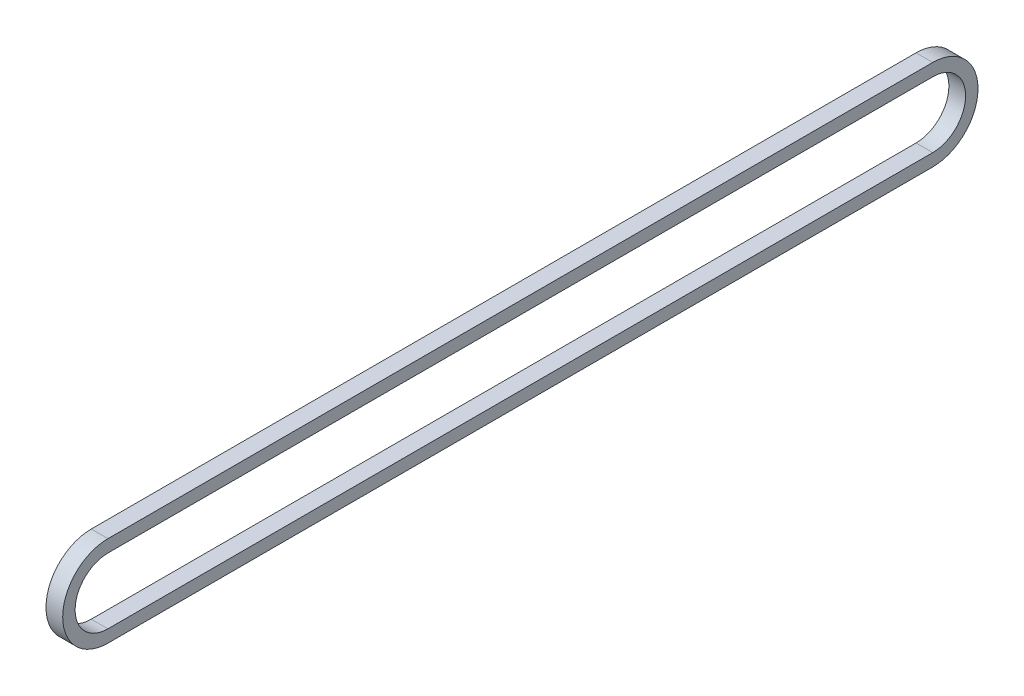
ISO-10303-21;
HEADER;
FILE_DESCRIPTION(('STEP AP214'),'2;1');
FILE_NAME('part.step','',(''),(''),'','','');
FILE_SCHEMA(('AUTOMOTIVE_DESIGN { 1 0 10303 214 1 1 1 1 }'));
ENDSEC;
DATA;
#1=APPLICATION_CONTEXT('core data for automotive mechanical design processes');
#2=APPLICATION_PROTOCOL_DEFINITION('international standard','automotive_design',2000,#1);
#3=PRODUCT_CONTEXT('',#1,'mechanical');
#4=PRODUCT('Part','Part','',(#3));
#5=PRODUCT_RELATED_PRODUCT_CATEGORY('part','',(#4));
#6=PRODUCT_DEFINITION_FORMATION('','',#4);
#7=PRODUCT_DEFINITION_CONTEXT('part definition',#1,'design');
#8=PRODUCT_DEFINITION('design','',#6,#7);
#9=PRODUCT_DEFINITION_SHAPE('','',#8);
#10=(LENGTH_UNIT() NAMED_UNIT(*) SI_UNIT(.MILLI.,.METRE.));
#11=(NAMED_UNIT(*) PLANE_ANGLE_UNIT() SI_UNIT($,.RADIAN.));
#12=(NAMED_UNIT(*) SI_UNIT($,.STERADIAN.) SOLID_ANGLE_UNIT());
#13=UNCERTAINTY_MEASURE_WITH_UNIT(LENGTH_MEASURE(1.E-05),#10,'distance_accuracy_value','');
#14=(GEOMETRIC_REPRESENTATION_CONTEXT(3) GLOBAL_UNCERTAINTY_ASSIGNED_CONTEXT((#13)) GLOBAL_UNIT_ASSIGNED_CONTEXT((#10,
#11,#12)) REPRESENTATION_CONTEXT('',''));
#15=CARTESIAN_POINT('',(0.,0.,0.));
#16=DIRECTION('',(0.,0.,1.));
#17=DIRECTION('',(1.,0.,0.));
#18=AXIS2_PLACEMENT_3D('',#15,#16,#17);
#19=CARTESIAN_POINT('',(3.8862,0.,0.));
#20=DIRECTION('',(1.,0.,0.));
#21=DIRECTION('',(0.,0.,-1.));
#22=AXIS2_PLACEMENT_3D('',#19,#20,#21);
#23=PLANE('',#22);
#24=CARTESIAN_POINT('',(3.8862,0.,0.));
#25=DIRECTION('',(1.,0.,0.));
#26=DIRECTION('',(0.,0.,-1.));
#27=AXIS2_PLACEMENT_3D('',#24,#25,#26);
#28=CIRCLE('',#27,21.082);
#29=CARTESIAN_POINT('',(3.8862,21.082,0.));
#30=VERTEX_POINT('',#29);
#31=CARTESIAN_POINT('',(3.8862,-21.082,0.));
#32=VERTEX_POINT('',#31);
#33=EDGE_CURVE('E165',#30,#32,#28,.T.);
#34=ORIENTED_EDGE('',*,*,#33,.T.);
#35=DIRECTION('',(0.,0.,-1.));
#36=VECTOR('',#35,1.);
#37=CARTESIAN_POINT('',(3.8862,-21.082,0.));
#38=LINE('',#37,#36);
#39=CARTESIAN_POINT('',(3.8862,-21.082,-384.172599954));
#40=VERTEX_POINT('',#39);
#41=EDGE_CURVE('E168',#32,#40,#38,.T.);
#42=ORIENTED_EDGE('',*,*,#41,.T.);
#43=CARTESIAN_POINT('',(3.8862,0.,-384.172599954));
#44=DIRECTION('',(1.,0.,0.));
#45=DIRECTION('',(0.,0.,-1.));
#46=AXIS2_PLACEMENT_3D('',#43,#44,#45);
#47=CIRCLE('',#46,21.082);
#48=CARTESIAN_POINT('',(3.8862,21.082,-384.172599954));
#49=VERTEX_POINT('',#48);
#50=EDGE_CURVE('E171',#40,#49,#47,.T.);
#51=ORIENTED_EDGE('',*,*,#50,.T.);
#52=DIRECTION('',(0.,0.,-1.));
#53=VECTOR('',#52,1.);
#54=CARTESIAN_POINT('',(3.8862,21.082,0.));
#55=LINE('',#54,#53);
#56=EDGE_CURVE('E173',#30,#49,#55,.T.);
#57=ORIENTED_EDGE('',*,*,#56,.F.);
#58=EDGE_LOOP('',(#34,#42,#51,#57));
#59=FACE_BOUND('',#58,.T.);
#60=DIRECTION('',(0.,0.,-1.));
#61=VECTOR('',#60,1.);
#62=CARTESIAN_POINT('',(3.8862,-15.2908,0.));
#63=LINE('',#62,#61);
#64=CARTESIAN_POINT('',(3.8862,-15.2908,0.));
#65=VERTEX_POINT('',#64);
#66=CARTESIAN_POINT('',(3.8862,-15.2908,-384.172599954));
#67=VERTEX_POINT('',#66);
#68=EDGE_CURVE('E138',#65,#67,#63,.T.);
#69=ORIENTED_EDGE('',*,*,#68,.F.);
#70=CARTESIAN_POINT('',(3.8862,0.,0.));
#71=DIRECTION('',(1.,0.,0.));
#72=DIRECTION('',(0.,0.,-1.));
#73=AXIS2_PLACEMENT_3D('',#70,#71,#72);
#74=CIRCLE('',#73,15.2908);
#75=CARTESIAN_POINT('',(3.8862,15.2908,0.));
#76=VERTEX_POINT('',#75);
#77=EDGE_CURVE('E130',#76,#65,#74,.T.);
#78=ORIENTED_EDGE('',*,*,#77,.F.);
#79=DIRECTION('',(0.,0.,-1.));
#80=VECTOR('',#79,1.);
#81=CARTESIAN_POINT('',(3.8862,15.2908,0.));
#82=LINE('',#81,#80);
#83=CARTESIAN_POINT('',(3.8862,15.2908,-384.172599954));
#84=VERTEX_POINT('',#83);
#85=EDGE_CURVE('E152',#76,#84,#82,.T.);
#86=ORIENTED_EDGE('',*,*,#85,.T.);
#87=CARTESIAN_POINT('',(3.8862,0.,-384.172599954));
#88=DIRECTION('',(1.,0.,0.));
#89=DIRECTION('',(0.,0.,-1.));
#90=AXIS2_PLACEMENT_3D('',#87,#88,#89);
#91=CIRCLE('',#90,15.2908);
#92=EDGE_CURVE('E150',#67,#84,#91,.T.);
#93=ORIENTED_EDGE('',*,*,#92,.F.);
#94=EDGE_LOOP('',(#69,#78,#86,#93));
#95=FACE_BOUND('',#94,.T.);
#96=ADVANCED_FACE('F65',(#59,#95),#23,.T.);
#97=CARTESIAN_POINT('',(-3.8862,0.,0.));
#98=DIRECTION('',(1.,0.,0.));
#99=DIRECTION('',(0.,0.,-1.));
#100=AXIS2_PLACEMENT_3D('',#97,#98,#99);
#101=PLANE('',#100);
#102=CARTESIAN_POINT('',(-3.8862,0.,0.));
#103=DIRECTION('',(1.,0.,0.));
#104=DIRECTION('',(0.,0.,-1.));
#105=AXIS2_PLACEMENT_3D('',#102,#103,#104);
#106=CIRCLE('',#105,21.082);
#107=CARTESIAN_POINT('',(-3.8862,21.082,0.));
#108=VERTEX_POINT('',#107);
#109=CARTESIAN_POINT('',(-3.8862,-21.082,0.));
#110=VERTEX_POINT('',#109);
#111=EDGE_CURVE('E146',#108,#110,#106,.T.);
#112=ORIENTED_EDGE('',*,*,#111,.F.);
#113=DIRECTION('',(0.,0.,-1.));
#114=VECTOR('',#113,1.);
#115=CARTESIAN_POINT('',(-3.8862,21.082,0.));
#116=LINE('',#115,#114);
#117=CARTESIAN_POINT('',(-3.8862,21.082,-384.172599954));
#118=VERTEX_POINT('',#117);
#119=EDGE_CURVE('E169',#108,#118,#116,.T.);
#120=ORIENTED_EDGE('',*,*,#119,.T.);
#121=CARTESIAN_POINT('',(-3.8862,0.,-384.172599954));
#122=DIRECTION('',(1.,0.,0.));
#123=DIRECTION('',(0.,0.,-1.));
#124=AXIS2_PLACEMENT_3D('',#121,#122,#123);
#125=CIRCLE('',#124,21.082);
#126=CARTESIAN_POINT('',(-3.8862,-21.082,-384.172599954));
#127=VERTEX_POINT('',#126);
#128=EDGE_CURVE('E181',#127,#118,#125,.T.);
#129=ORIENTED_EDGE('',*,*,#128,.F.);
#130=DIRECTION('',(0.,0.,-1.));
#131=VECTOR('',#130,1.);
#132=CARTESIAN_POINT('',(-3.8862,-21.082,0.));
#133=LINE('',#132,#131);
#134=EDGE_CURVE('E179',#110,#127,#133,.T.);
#135=ORIENTED_EDGE('',*,*,#134,.F.);
#136=EDGE_LOOP('',(#112,#120,#129,#135));
#137=FACE_BOUND('',#136,.T.);
#138=CARTESIAN_POINT('',(-3.8862,0.,0.));
#139=DIRECTION('',(1.,0.,0.));
#140=DIRECTION('',(0.,0.,-1.));
#141=AXIS2_PLACEMENT_3D('',#138,#139,#140);
#142=CIRCLE('',#141,15.2908);
#143=CARTESIAN_POINT('',(-3.8862,15.2908,0.));
#144=VERTEX_POINT('',#143);
#145=CARTESIAN_POINT('',(-3.8862,-15.2908,0.));
#146=VERTEX_POINT('',#145);
#147=EDGE_CURVE('E88',#144,#146,#142,.T.);
#148=ORIENTED_EDGE('',*,*,#147,.T.);
#149=DIRECTION('',(0.,0.,-1.));
#150=VECTOR('',#149,1.);
#151=CARTESIAN_POINT('',(-3.8862,-15.2908,0.));
#152=LINE('',#151,#150);
#153=CARTESIAN_POINT('',(-3.8862,-15.2908,-384.172599954));
#154=VERTEX_POINT('',#153);
#155=EDGE_CURVE('E145',#146,#154,#152,.T.);
#156=ORIENTED_EDGE('',*,*,#155,.T.);
#157=CARTESIAN_POINT('',(-3.8862,0.,-384.172599954));
#158=DIRECTION('',(1.,0.,0.));
#159=DIRECTION('',(0.,0.,-1.));
#160=AXIS2_PLACEMENT_3D('',#157,#158,#159);
#161=CIRCLE('',#160,15.2908);
#162=CARTESIAN_POINT('',(-3.8862,15.2908,-384.172599954));
#163=VERTEX_POINT('',#162);
#164=EDGE_CURVE('E158',#154,#163,#161,.T.);
#165=ORIENTED_EDGE('',*,*,#164,.T.);
#166=DIRECTION('',(0.,0.,-1.));
#167=VECTOR('',#166,1.);
#168=CARTESIAN_POINT('',(-3.8862,15.2908,0.));
#169=LINE('',#168,#167);
#170=EDGE_CURVE('E139',#144,#163,#169,.T.);
#171=ORIENTED_EDGE('',*,*,#170,.F.);
#172=EDGE_LOOP('',(#148,#156,#165,#171));
#173=FACE_BOUND('',#172,.T.);
#174=ADVANCED_FACE('F198',(#137,#173),#101,.F.);
#175=CARTESIAN_POINT('',(3.8862,0.,0.));
#176=DIRECTION('',(-1.,0.,0.));
#177=DIRECTION('',(0.,0.,1.));
#178=AXIS2_PLACEMENT_3D('',#175,#176,#177);
#179=CYLINDRICAL_SURFACE('',#178,21.082);
#180=ORIENTED_EDGE('',*,*,#111,.T.);
#181=DIRECTION('',(-1.,0.,0.));
#182=VECTOR('',#181,1.);
#183=CARTESIAN_POINT('',(3.8862,-21.082,0.));
#184=LINE('',#183,#182);
#185=EDGE_CURVE('E12',#32,#110,#184,.T.);
#186=ORIENTED_EDGE('',*,*,#185,.F.);
#187=ORIENTED_EDGE('',*,*,#33,.F.);
#188=DIRECTION('',(-1.,0.,0.));
#189=VECTOR('',#188,1.);
#190=CARTESIAN_POINT('',(3.8862,21.082,0.));
#191=LINE('',#190,#189);
#192=EDGE_CURVE('E176',#30,#108,#191,.T.);
#193=ORIENTED_EDGE('',*,*,#192,.T.);
#194=EDGE_LOOP('',(#180,#186,#187,#193));
#195=FACE_BOUND('',#194,.T.);
#196=ADVANCED_FACE('F67',(#195),#179,.T.);
#197=CARTESIAN_POINT('',(3.8862,-21.082,0.));
#198=DIRECTION('',(0.,1.,0.));
#199=DIRECTION('',(0.,0.,1.));
#200=AXIS2_PLACEMENT_3D('',#197,#198,#199);
#201=PLANE('',#200);
#202=ORIENTED_EDGE('',*,*,#134,.T.);
#203=DIRECTION('',(-1.,0.,0.));
#204=VECTOR('',#203,1.);
#205=CARTESIAN_POINT('',(3.8862,-21.082,-384.172599954));
#206=LINE('',#205,#204);
#207=EDGE_CURVE('E73',#40,#127,#206,.T.);
#208=ORIENTED_EDGE('',*,*,#207,.F.);
#209=ORIENTED_EDGE('',*,*,#41,.F.);
#210=ORIENTED_EDGE('',*,*,#185,.T.);
#211=EDGE_LOOP('',(#202,#208,#209,#210));
#212=FACE_BOUND('',#211,.T.);
#213=ADVANCED_FACE('F207',(#212),#201,.F.);
#214=CARTESIAN_POINT('',(3.8862,0.,-384.172599954));
#215=DIRECTION('',(-1.,0.,0.));
#216=DIRECTION('',(0.,0.,1.));
#217=AXIS2_PLACEMENT_3D('',#214,#215,#216);
#218=CYLINDRICAL_SURFACE('',#217,21.082);
#219=ORIENTED_EDGE('',*,*,#128,.T.);
#220=DIRECTION('',(-1.,0.,0.));
#221=VECTOR('',#220,1.);
#222=CARTESIAN_POINT('',(3.8862,21.082,-384.172599954));
#223=LINE('',#222,#221);
#224=EDGE_CURVE('E187',#49,#118,#223,.T.);
#225=ORIENTED_EDGE('',*,*,#224,.F.);
#226=ORIENTED_EDGE('',*,*,#50,.F.);
#227=ORIENTED_EDGE('',*,*,#207,.T.);
#228=EDGE_LOOP('',(#219,#225,#226,#227));
#229=FACE_BOUND('',#228,.T.);
#230=ADVANCED_FACE('F193',(#229),#218,.T.);
#231=CARTESIAN_POINT('',(3.8862,21.082,0.));
#232=DIRECTION('',(0.,1.,0.));
#233=DIRECTION('',(0.,0.,1.));
#234=AXIS2_PLACEMENT_3D('',#231,#232,#233);
#235=PLANE('',#234);
#236=ORIENTED_EDGE('',*,*,#119,.F.);
#237=ORIENTED_EDGE('',*,*,#192,.F.);
#238=ORIENTED_EDGE('',*,*,#56,.T.);
#239=ORIENTED_EDGE('',*,*,#224,.T.);
#240=EDGE_LOOP('',(#236,#237,#238,#239));
#241=FACE_BOUND('',#240,.T.);
#242=ADVANCED_FACE('F202',(#241),#235,.T.);
#243=CARTESIAN_POINT('',(3.8862,0.,0.));
#244=DIRECTION('',(-1.,0.,0.));
#245=DIRECTION('',(0.,0.,1.));
#246=AXIS2_PLACEMENT_3D('',#243,#244,#245);
#247=CYLINDRICAL_SURFACE('',#246,15.2908);
#248=ORIENTED_EDGE('',*,*,#147,.F.);
#249=DIRECTION('',(-1.,0.,0.));
#250=VECTOR('',#249,1.);
#251=CARTESIAN_POINT('',(3.8862,15.2908,0.));
#252=LINE('',#251,#250);
#253=EDGE_CURVE('E134',#76,#144,#252,.T.);
#254=ORIENTED_EDGE('',*,*,#253,.F.);
#255=ORIENTED_EDGE('',*,*,#77,.T.);
#256=DIRECTION('',(-1.,0.,0.));
#257=VECTOR('',#256,1.);
#258=CARTESIAN_POINT('',(3.8862,-15.2908,0.));
#259=LINE('',#258,#257);
#260=EDGE_CURVE('E133',#65,#146,#259,.T.);
#261=ORIENTED_EDGE('',*,*,#260,.T.);
#262=EDGE_LOOP('',(#248,#254,#255,#261));
#263=FACE_BOUND('',#262,.T.);
#264=ADVANCED_FACE('F132',(#263),#247,.F.);
#265=CARTESIAN_POINT('',(3.8862,-15.2908,0.));
#266=DIRECTION('',(0.,1.,0.));
#267=DIRECTION('',(0.,0.,1.));
#268=AXIS2_PLACEMENT_3D('',#265,#266,#267);
#269=PLANE('',#268);
#270=ORIENTED_EDGE('',*,*,#155,.F.);
#271=ORIENTED_EDGE('',*,*,#260,.F.);
#272=ORIENTED_EDGE('',*,*,#68,.T.);
#273=DIRECTION('',(-1.,0.,0.));
#274=VECTOR('',#273,1.);
#275=CARTESIAN_POINT('',(3.8862,-15.2908,-384.172599954));
#276=LINE('',#275,#274);
#277=EDGE_CURVE('E147',#67,#154,#276,.T.);
#278=ORIENTED_EDGE('',*,*,#277,.T.);
#279=EDGE_LOOP('',(#270,#271,#272,#278));
#280=FACE_BOUND('',#279,.T.);
#281=ADVANCED_FACE('F142',(#280),#269,.T.);
#282=CARTESIAN_POINT('',(3.8862,0.,-384.172599954));
#283=DIRECTION('',(-1.,0.,0.));
#284=DIRECTION('',(0.,0.,1.));
#285=AXIS2_PLACEMENT_3D('',#282,#283,#284);
#286=CYLINDRICAL_SURFACE('',#285,15.2908);
#287=ORIENTED_EDGE('',*,*,#164,.F.);
#288=ORIENTED_EDGE('',*,*,#277,.F.);
#289=ORIENTED_EDGE('',*,*,#92,.T.);
#290=DIRECTION('',(-1.,0.,0.));
#291=VECTOR('',#290,1.);
#292=CARTESIAN_POINT('',(3.8862,15.2908,-384.172599954));
#293=LINE('',#292,#291);
#294=EDGE_CURVE('E80',#84,#163,#293,.T.);
#295=ORIENTED_EDGE('',*,*,#294,.T.);
#296=EDGE_LOOP('',(#287,#288,#289,#295));
#297=FACE_BOUND('',#296,.T.);
#298=ADVANCED_FACE('F244',(#297),#286,.F.);
#299=CARTESIAN_POINT('',(3.8862,15.2908,0.));
#300=DIRECTION('',(0.,1.,0.));
#301=DIRECTION('',(0.,0.,1.));
#302=AXIS2_PLACEMENT_3D('',#299,#300,#301);
#303=PLANE('',#302);
#304=ORIENTED_EDGE('',*,*,#170,.T.);
#305=ORIENTED_EDGE('',*,*,#294,.F.);
#306=ORIENTED_EDGE('',*,*,#85,.F.);
#307=ORIENTED_EDGE('',*,*,#253,.T.);
#308=EDGE_LOOP('',(#304,#305,#306,#307));
#309=FACE_BOUND('',#308,.T.);
#310=ADVANCED_FACE('F250',(#309),#303,.F.);
#311=CLOSED_SHELL('',(#96,#174,#196,#213,#230,#242,#264,#281,#298,#310));
#312=MANIFOLD_SOLID_BREP('B2',#311);
#313=ADVANCED_BREP_SHAPE_REPRESENTATION('',(#18,#312),#14);
#314=SHAPE_DEFINITION_REPRESENTATION(#9,#313);
ENDSEC;
END-ISO-10303-21;
